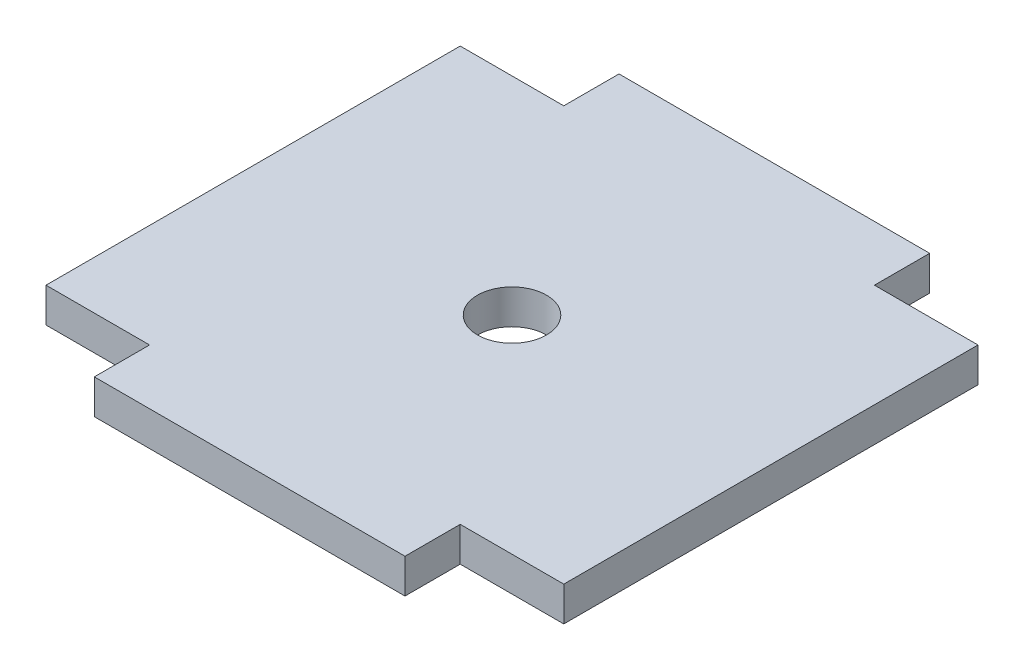
ISO-10303-21;
HEADER;
FILE_DESCRIPTION(('STEP AP214'),'2;1');
FILE_NAME('part.step','',(''),(''),'','','');
FILE_SCHEMA(('AUTOMOTIVE_DESIGN { 1 0 10303 214 1 1 1 1 }'));
ENDSEC;
DATA;
#1=APPLICATION_CONTEXT('core data for automotive mechanical design processes');
#2=APPLICATION_PROTOCOL_DEFINITION('international standard','automotive_design',2000,#1);
#3=PRODUCT_CONTEXT('',#1,'mechanical');
#4=PRODUCT('Part','Part','',(#3));
#5=PRODUCT_RELATED_PRODUCT_CATEGORY('part','',(#4));
#6=PRODUCT_DEFINITION_FORMATION('','',#4);
#7=PRODUCT_DEFINITION_CONTEXT('part definition',#1,'design');
#8=PRODUCT_DEFINITION('design','',#6,#7);
#9=PRODUCT_DEFINITION_SHAPE('','',#8);
#10=(LENGTH_UNIT() NAMED_UNIT(*) SI_UNIT(.MILLI.,.METRE.));
#11=(NAMED_UNIT(*) PLANE_ANGLE_UNIT() SI_UNIT($,.RADIAN.));
#12=(NAMED_UNIT(*) SI_UNIT($,.STERADIAN.) SOLID_ANGLE_UNIT());
#13=UNCERTAINTY_MEASURE_WITH_UNIT(LENGTH_MEASURE(1.E-05),#10,'distance_accuracy_value','');
#14=(GEOMETRIC_REPRESENTATION_CONTEXT(3) GLOBAL_UNCERTAINTY_ASSIGNED_CONTEXT((#13)) GLOBAL_UNIT_ASSIGNED_CONTEXT((#10,
#11,#12)) REPRESENTATION_CONTEXT('',''));
#15=CARTESIAN_POINT('',(0.,0.,0.));
#16=DIRECTION('',(0.,0.,1.));
#17=DIRECTION('',(1.,0.,0.));
#18=AXIS2_PLACEMENT_3D('',#15,#16,#17);
#19=CARTESIAN_POINT('',(-37.5,5.,-30.));
#20=DIRECTION('',(0.,0.,1.));
#21=DIRECTION('',(1.,0.,0.));
#22=AXIS2_PLACEMENT_3D('',#19,#20,#21);
#23=PLANE('',#22);
#24=DIRECTION('',(-1.,0.,0.));
#25=VECTOR('',#24,1.);
#26=CARTESIAN_POINT('',(-37.5,0.,-30.));
#27=LINE('',#26,#25);
#28=CARTESIAN_POINT('',(37.5,0.,-30.));
#29=VERTEX_POINT('',#28);
#30=CARTESIAN_POINT('',(22.5,0.,-30.));
#31=VERTEX_POINT('',#30);
#32=EDGE_CURVE('E222',#29,#31,#27,.T.);
#33=ORIENTED_EDGE('',*,*,#32,.T.);
#34=DIRECTION('',(0.,1.,0.));
#35=VECTOR('',#34,1.);
#36=CARTESIAN_POINT('',(22.5,0.,-30.));
#37=LINE('',#36,#35);
#38=CARTESIAN_POINT('',(22.5,5.,-30.));
#39=VERTEX_POINT('',#38);
#40=EDGE_CURVE('E131',#31,#39,#37,.T.);
#41=ORIENTED_EDGE('',*,*,#40,.T.);
#42=DIRECTION('',(-1.,0.,0.));
#43=VECTOR('',#42,1.);
#44=CARTESIAN_POINT('',(-37.5,5.,-30.));
#45=LINE('',#44,#43);
#46=CARTESIAN_POINT('',(37.5,5.,-30.));
#47=VERTEX_POINT('',#46);
#48=EDGE_CURVE('E174',#47,#39,#45,.T.);
#49=ORIENTED_EDGE('',*,*,#48,.F.);
#50=DIRECTION('',(0.,-1.,0.));
#51=VECTOR('',#50,1.);
#52=CARTESIAN_POINT('',(37.5,5.,-30.));
#53=LINE('',#52,#51);
#54=EDGE_CURVE('E11',#47,#29,#53,.T.);
#55=ORIENTED_EDGE('',*,*,#54,.T.);
#56=EDGE_LOOP('',(#33,#41,#49,#55));
#57=FACE_BOUND('',#56,.T.);
#58=ADVANCED_FACE('F33',(#57),#23,.F.);
#59=CARTESIAN_POINT('',(-37.5,5.,30.));
#60=DIRECTION('',(0.,0.,-1.));
#61=DIRECTION('',(-1.,0.,0.));
#62=AXIS2_PLACEMENT_3D('',#59,#60,#61);
#63=PLANE('',#62);
#64=DIRECTION('',(0.,1.,0.));
#65=VECTOR('',#64,1.);
#66=CARTESIAN_POINT('',(22.5,0.,30.));
#67=LINE('',#66,#65);
#68=CARTESIAN_POINT('',(22.5,0.,30.));
#69=VERTEX_POINT('',#68);
#70=CARTESIAN_POINT('',(22.5,5.,30.));
#71=VERTEX_POINT('',#70);
#72=EDGE_CURVE('E135',#69,#71,#67,.T.);
#73=ORIENTED_EDGE('',*,*,#72,.F.);
#74=DIRECTION('',(1.,0.,0.));
#75=VECTOR('',#74,1.);
#76=CARTESIAN_POINT('',(-37.5,0.,30.));
#77=LINE('',#76,#75);
#78=CARTESIAN_POINT('',(37.5,0.,30.));
#79=VERTEX_POINT('',#78);
#80=EDGE_CURVE('E196',#69,#79,#77,.T.);
#81=ORIENTED_EDGE('',*,*,#80,.T.);
#82=DIRECTION('',(0.,-1.,0.));
#83=VECTOR('',#82,1.);
#84=CARTESIAN_POINT('',(37.5,5.,30.));
#85=LINE('',#84,#83);
#86=CARTESIAN_POINT('',(37.5,5.,30.));
#87=VERTEX_POINT('',#86);
#88=EDGE_CURVE('E195',#87,#79,#85,.T.);
#89=ORIENTED_EDGE('',*,*,#88,.F.);
#90=DIRECTION('',(1.,0.,0.));
#91=VECTOR('',#90,1.);
#92=CARTESIAN_POINT('',(-37.5,5.,30.));
#93=LINE('',#92,#91);
#94=EDGE_CURVE('E58',#71,#87,#93,.T.);
#95=ORIENTED_EDGE('',*,*,#94,.F.);
#96=EDGE_LOOP('',(#73,#81,#89,#95));
#97=FACE_BOUND('',#96,.T.);
#98=ADVANCED_FACE('F295',(#97),#63,.F.);
#99=DIRECTION('',(0.,-1.,0.));
#100=VECTOR('',#99,1.);
#101=CARTESIAN_POINT('',(-22.5,0.,30.));
#102=LINE('',#101,#100);
#103=CARTESIAN_POINT('',(-22.5,5.,30.));
#104=VERTEX_POINT('',#103);
#105=CARTESIAN_POINT('',(-22.5,0.,30.));
#106=VERTEX_POINT('',#105);
#107=EDGE_CURVE('E238',#104,#106,#102,.T.);
#108=ORIENTED_EDGE('',*,*,#107,.F.);
#109=CARTESIAN_POINT('',(-37.5,5.,30.));
#110=VERTEX_POINT('',#109);
#111=EDGE_CURVE('E192',#110,#104,#93,.T.);
#112=ORIENTED_EDGE('',*,*,#111,.F.);
#113=DIRECTION('',(0.,-1.,0.));
#114=VECTOR('',#113,1.);
#115=CARTESIAN_POINT('',(-37.5,5.,30.));
#116=LINE('',#115,#114);
#117=CARTESIAN_POINT('',(-37.5,0.,30.));
#118=VERTEX_POINT('',#117);
#119=EDGE_CURVE('E207',#110,#118,#116,.T.);
#120=ORIENTED_EDGE('',*,*,#119,.T.);
#121=EDGE_CURVE('E199',#118,#106,#77,.T.);
#122=ORIENTED_EDGE('',*,*,#121,.T.);
#123=EDGE_LOOP('',(#108,#112,#120,#122));
#124=FACE_BOUND('',#123,.T.);
#125=ADVANCED_FACE('F278',(#124),#63,.F.);
#126=CARTESIAN_POINT('',(37.5,5.,30.));
#127=DIRECTION('',(-1.,0.,0.));
#128=DIRECTION('',(0.,0.,1.));
#129=AXIS2_PLACEMENT_3D('',#126,#127,#128);
#130=PLANE('',#129);
#131=DIRECTION('',(0.,0.,-1.));
#132=VECTOR('',#131,1.);
#133=CARTESIAN_POINT('',(37.5,0.,30.));
#134=LINE('',#133,#132);
#135=EDGE_CURVE('E186',#79,#29,#134,.T.);
#136=ORIENTED_EDGE('',*,*,#135,.T.);
#137=ORIENTED_EDGE('',*,*,#54,.F.);
#138=DIRECTION('',(0.,0.,-1.));
#139=VECTOR('',#138,1.);
#140=CARTESIAN_POINT('',(37.5,5.,30.));
#141=LINE('',#140,#139);
#142=EDGE_CURVE('E175',#87,#47,#141,.T.);
#143=ORIENTED_EDGE('',*,*,#142,.F.);
#144=ORIENTED_EDGE('',*,*,#88,.T.);
#145=EDGE_LOOP('',(#136,#137,#143,#144));
#146=FACE_BOUND('',#145,.T.);
#147=ADVANCED_FACE('F35',(#146),#130,.F.);
#148=CARTESIAN_POINT('',(-22.5,5.,-30.));
#149=VERTEX_POINT('',#148);
#150=CARTESIAN_POINT('',(-37.5,5.,-30.));
#151=VERTEX_POINT('',#150);
#152=EDGE_CURVE('E171',#149,#151,#45,.T.);
#153=ORIENTED_EDGE('',*,*,#152,.F.);
#154=DIRECTION('',(0.,-1.,0.));
#155=VECTOR('',#154,1.);
#156=CARTESIAN_POINT('',(-22.5,0.,-30.));
#157=LINE('',#156,#155);
#158=CARTESIAN_POINT('',(-22.5,0.,-30.));
#159=VERTEX_POINT('',#158);
#160=EDGE_CURVE('E143',#149,#159,#157,.T.);
#161=ORIENTED_EDGE('',*,*,#160,.T.);
#162=CARTESIAN_POINT('',(-37.5,0.,-30.));
#163=VERTEX_POINT('',#162);
#164=EDGE_CURVE('E220',#159,#163,#27,.T.);
#165=ORIENTED_EDGE('',*,*,#164,.T.);
#166=DIRECTION('',(0.,-1.,0.));
#167=VECTOR('',#166,1.);
#168=CARTESIAN_POINT('',(-37.5,5.,-30.));
#169=LINE('',#168,#167);
#170=EDGE_CURVE('E42',#151,#163,#169,.T.);
#171=ORIENTED_EDGE('',*,*,#170,.F.);
#172=EDGE_LOOP('',(#153,#161,#165,#171));
#173=FACE_BOUND('',#172,.T.);
#174=ADVANCED_FACE('F302',(#173),#23,.F.);
#175=CARTESIAN_POINT('',(-37.5,5.,30.));
#176=DIRECTION('',(1.,0.,0.));
#177=DIRECTION('',(0.,0.,-1.));
#178=AXIS2_PLACEMENT_3D('',#175,#176,#177);
#179=PLANE('',#178);
#180=DIRECTION('',(0.,0.,1.));
#181=VECTOR('',#180,1.);
#182=CARTESIAN_POINT('',(-37.5,0.,30.));
#183=LINE('',#182,#181);
#184=EDGE_CURVE('E200',#163,#118,#183,.T.);
#185=ORIENTED_EDGE('',*,*,#184,.T.);
#186=ORIENTED_EDGE('',*,*,#119,.F.);
#187=DIRECTION('',(0.,0.,1.));
#188=VECTOR('',#187,1.);
#189=CARTESIAN_POINT('',(-37.5,5.,30.));
#190=LINE('',#189,#188);
#191=EDGE_CURVE('E181',#151,#110,#190,.T.);
#192=ORIENTED_EDGE('',*,*,#191,.F.);
#193=ORIENTED_EDGE('',*,*,#170,.T.);
#194=EDGE_LOOP('',(#185,#186,#192,#193));
#195=FACE_BOUND('',#194,.T.);
#196=ADVANCED_FACE('F215',(#195),#179,.F.);
#197=CARTESIAN_POINT('',(37.5,5.,-30.));
#198=DIRECTION('',(0.,-1.,0.));
#199=DIRECTION('',(0.,0.,-1.));
#200=AXIS2_PLACEMENT_3D('',#197,#198,#199);
#201=PLANE('',#200);
#202=CARTESIAN_POINT('',(0.,5.,0.));
#203=DIRECTION('',(0.,1.,0.));
#204=DIRECTION('',(0.,0.,1.));
#205=AXIS2_PLACEMENT_3D('',#202,#203,#204);
#206=CIRCLE('',#205,5.);
#207=CARTESIAN_POINT('',(0.,5.,5.));
#208=VERTEX_POINT('',#207);
#209=EDGE_CURVE('E259',#208,#208,#206,.T.);
#210=ORIENTED_EDGE('',*,*,#209,.F.);
#211=EDGE_LOOP('',(#210));
#212=FACE_BOUND('',#211,.T.);
#213=ORIENTED_EDGE('',*,*,#142,.T.);
#214=ORIENTED_EDGE('',*,*,#48,.T.);
#215=DIRECTION('',(0.,0.,1.));
#216=VECTOR('',#215,1.);
#217=CARTESIAN_POINT('',(22.5,5.,-38.));
#218=LINE('',#217,#216);
#219=CARTESIAN_POINT('',(22.5,5.,-38.));
#220=VERTEX_POINT('',#219);
#221=EDGE_CURVE('E153',#220,#39,#218,.T.);
#222=ORIENTED_EDGE('',*,*,#221,.F.);
#223=DIRECTION('',(-1.,0.,0.));
#224=VECTOR('',#223,1.);
#225=CARTESIAN_POINT('',(-22.5,5.,-38.));
#226=LINE('',#225,#224);
#227=CARTESIAN_POINT('',(-22.5,5.,-38.));
#228=VERTEX_POINT('',#227);
#229=EDGE_CURVE('E142',#220,#228,#226,.T.);
#230=ORIENTED_EDGE('',*,*,#229,.T.);
#231=DIRECTION('',(0.,0.,1.));
#232=VECTOR('',#231,1.);
#233=CARTESIAN_POINT('',(-22.5,5.,-38.));
#234=LINE('',#233,#232);
#235=EDGE_CURVE('E163',#228,#149,#234,.T.);
#236=ORIENTED_EDGE('',*,*,#235,.T.);
#237=ORIENTED_EDGE('',*,*,#152,.T.);
#238=ORIENTED_EDGE('',*,*,#191,.T.);
#239=ORIENTED_EDGE('',*,*,#111,.T.);
#240=DIRECTION('',(0.,0.,-1.));
#241=VECTOR('',#240,1.);
#242=CARTESIAN_POINT('',(-22.5,5.,38.));
#243=LINE('',#242,#241);
#244=CARTESIAN_POINT('',(-22.5,5.,38.));
#245=VERTEX_POINT('',#244);
#246=EDGE_CURVE('E252',#245,#104,#243,.T.);
#247=ORIENTED_EDGE('',*,*,#246,.F.);
#248=DIRECTION('',(-1.,0.,0.));
#249=VECTOR('',#248,1.);
#250=CARTESIAN_POINT('',(-22.5,5.,38.));
#251=LINE('',#250,#249);
#252=CARTESIAN_POINT('',(22.5,5.,38.));
#253=VERTEX_POINT('',#252);
#254=EDGE_CURVE('E290',#253,#245,#251,.T.);
#255=ORIENTED_EDGE('',*,*,#254,.F.);
#256=DIRECTION('',(0.,0.,-1.));
#257=VECTOR('',#256,1.);
#258=CARTESIAN_POINT('',(22.5,5.,38.));
#259=LINE('',#258,#257);
#260=EDGE_CURVE('E257',#253,#71,#259,.T.);
#261=ORIENTED_EDGE('',*,*,#260,.T.);
#262=ORIENTED_EDGE('',*,*,#94,.T.);
#263=EDGE_LOOP('',(#213,#214,#222,#230,#236,#237,#238,#239,#247,#255,#261,#262));
#264=FACE_BOUND('',#263,.T.);
#265=ADVANCED_FACE('F276',(#212,#264),#201,.F.);
#266=CARTESIAN_POINT('',(37.5,0.,-30.));
#267=DIRECTION('',(0.,-1.,0.));
#268=DIRECTION('',(0.,0.,-1.));
#269=AXIS2_PLACEMENT_3D('',#266,#267,#268);
#270=PLANE('',#269);
#271=CARTESIAN_POINT('',(0.,0.,0.));
#272=DIRECTION('',(0.,1.,0.));
#273=DIRECTION('',(0.,0.,1.));
#274=AXIS2_PLACEMENT_3D('',#271,#272,#273);
#275=CIRCLE('',#274,5.);
#276=CARTESIAN_POINT('',(0.,0.,5.));
#277=VERTEX_POINT('',#276);
#278=EDGE_CURVE('E247',#277,#277,#275,.T.);
#279=ORIENTED_EDGE('',*,*,#278,.T.);
#280=EDGE_LOOP('',(#279));
#281=FACE_BOUND('',#280,.T.);
#282=ORIENTED_EDGE('',*,*,#135,.F.);
#283=ORIENTED_EDGE('',*,*,#80,.F.);
#284=DIRECTION('',(0.,0.,-1.));
#285=VECTOR('',#284,1.);
#286=CARTESIAN_POINT('',(22.5,0.,38.));
#287=LINE('',#286,#285);
#288=CARTESIAN_POINT('',(22.5,0.,38.));
#289=VERTEX_POINT('',#288);
#290=EDGE_CURVE('E230',#289,#69,#287,.T.);
#291=ORIENTED_EDGE('',*,*,#290,.F.);
#292=DIRECTION('',(1.,0.,0.));
#293=VECTOR('',#292,1.);
#294=CARTESIAN_POINT('',(-22.5,0.,38.));
#295=LINE('',#294,#293);
#296=CARTESIAN_POINT('',(-22.5,0.,38.));
#297=VERTEX_POINT('',#296);
#298=EDGE_CURVE('E234',#297,#289,#295,.T.);
#299=ORIENTED_EDGE('',*,*,#298,.F.);
#300=DIRECTION('',(0.,0.,-1.));
#301=VECTOR('',#300,1.);
#302=CARTESIAN_POINT('',(-22.5,0.,38.));
#303=LINE('',#302,#301);
#304=EDGE_CURVE('E233',#297,#106,#303,.T.);
#305=ORIENTED_EDGE('',*,*,#304,.T.);
#306=ORIENTED_EDGE('',*,*,#121,.F.);
#307=ORIENTED_EDGE('',*,*,#184,.F.);
#308=ORIENTED_EDGE('',*,*,#164,.F.);
#309=DIRECTION('',(0.,0.,1.));
#310=VECTOR('',#309,1.);
#311=CARTESIAN_POINT('',(-22.5,0.,-38.));
#312=LINE('',#311,#310);
#313=CARTESIAN_POINT('',(-22.5,0.,-38.));
#314=VERTEX_POINT('',#313);
#315=EDGE_CURVE('E50',#314,#159,#312,.T.);
#316=ORIENTED_EDGE('',*,*,#315,.F.);
#317=DIRECTION('',(1.,0.,0.));
#318=VECTOR('',#317,1.);
#319=CARTESIAN_POINT('',(-22.5,0.,-38.));
#320=LINE('',#319,#318);
#321=CARTESIAN_POINT('',(22.5,0.,-38.));
#322=VERTEX_POINT('',#321);
#323=EDGE_CURVE('E140',#314,#322,#320,.T.);
#324=ORIENTED_EDGE('',*,*,#323,.T.);
#325=DIRECTION('',(0.,0.,1.));
#326=VECTOR('',#325,1.);
#327=CARTESIAN_POINT('',(22.5,0.,-38.));
#328=LINE('',#327,#326);
#329=EDGE_CURVE('E125',#322,#31,#328,.T.);
#330=ORIENTED_EDGE('',*,*,#329,.T.);
#331=ORIENTED_EDGE('',*,*,#32,.F.);
#332=EDGE_LOOP('',(#282,#283,#291,#299,#305,#306,#307,#308,#316,#324,#330,#331));
#333=FACE_BOUND('',#332,.T.);
#334=ADVANCED_FACE('F146',(#281,#333),#270,.T.);
#335=CARTESIAN_POINT('',(0.,0.,0.));
#336=DIRECTION('',(0.,1.,0.));
#337=DIRECTION('',(0.,0.,1.));
#338=AXIS2_PLACEMENT_3D('',#335,#336,#337);
#339=CYLINDRICAL_SURFACE('',#338,5.);
#340=ORIENTED_EDGE('',*,*,#278,.F.);
#341=EDGE_LOOP('',(#340));
#342=FACE_BOUND('',#341,.T.);
#343=ORIENTED_EDGE('',*,*,#209,.T.);
#344=EDGE_LOOP('',(#343));
#345=FACE_BOUND('',#344,.T.);
#346=ADVANCED_FACE('F327',(#342,#345),#339,.F.);
#347=CARTESIAN_POINT('',(22.5,0.,38.));
#348=DIRECTION('',(-1.,0.,0.));
#349=DIRECTION('',(0.,0.,1.));
#350=AXIS2_PLACEMENT_3D('',#347,#348,#349);
#351=PLANE('',#350);
#352=ORIENTED_EDGE('',*,*,#72,.T.);
#353=ORIENTED_EDGE('',*,*,#260,.F.);
#354=DIRECTION('',(0.,1.,0.));
#355=VECTOR('',#354,1.);
#356=CARTESIAN_POINT('',(22.5,0.,38.));
#357=LINE('',#356,#355);
#358=EDGE_CURVE('E250',#289,#253,#357,.T.);
#359=ORIENTED_EDGE('',*,*,#358,.F.);
#360=ORIENTED_EDGE('',*,*,#290,.T.);
#361=EDGE_LOOP('',(#352,#353,#359,#360));
#362=FACE_BOUND('',#361,.T.);
#363=ADVANCED_FACE('F294',(#362),#351,.F.);
#364=CARTESIAN_POINT('',(-22.5,0.,38.));
#365=DIRECTION('',(1.,0.,0.));
#366=DIRECTION('',(0.,0.,-1.));
#367=AXIS2_PLACEMENT_3D('',#364,#365,#366);
#368=PLANE('',#367);
#369=ORIENTED_EDGE('',*,*,#107,.T.);
#370=ORIENTED_EDGE('',*,*,#304,.F.);
#371=DIRECTION('',(0.,-1.,0.));
#372=VECTOR('',#371,1.);
#373=CARTESIAN_POINT('',(-22.5,0.,38.));
#374=LINE('',#373,#372);
#375=EDGE_CURVE('E289',#245,#297,#374,.T.);
#376=ORIENTED_EDGE('',*,*,#375,.F.);
#377=ORIENTED_EDGE('',*,*,#246,.T.);
#378=EDGE_LOOP('',(#369,#370,#376,#377));
#379=FACE_BOUND('',#378,.T.);
#380=ADVANCED_FACE('F282',(#379),#368,.F.);
#381=CARTESIAN_POINT('',(22.5,5.,38.));
#382=DIRECTION('',(0.,0.,-1.));
#383=DIRECTION('',(-1.,0.,0.));
#384=AXIS2_PLACEMENT_3D('',#381,#382,#383);
#385=PLANE('',#384);
#386=ORIENTED_EDGE('',*,*,#358,.T.);
#387=ORIENTED_EDGE('',*,*,#254,.T.);
#388=ORIENTED_EDGE('',*,*,#375,.T.);
#389=ORIENTED_EDGE('',*,*,#298,.T.);
#390=EDGE_LOOP('',(#386,#387,#388,#389));
#391=FACE_BOUND('',#390,.T.);
#392=ADVANCED_FACE('F292',(#391),#385,.F.);
#393=CARTESIAN_POINT('',(22.5,0.,-38.));
#394=DIRECTION('',(1.,0.,0.));
#395=DIRECTION('',(0.,0.,-1.));
#396=AXIS2_PLACEMENT_3D('',#393,#394,#395);
#397=PLANE('',#396);
#398=ORIENTED_EDGE('',*,*,#40,.F.);
#399=ORIENTED_EDGE('',*,*,#329,.F.);
#400=DIRECTION('',(0.,1.,0.));
#401=VECTOR('',#400,1.);
#402=CARTESIAN_POINT('',(22.5,0.,-38.));
#403=LINE('',#402,#401);
#404=EDGE_CURVE('E128',#322,#220,#403,.T.);
#405=ORIENTED_EDGE('',*,*,#404,.T.);
#406=ORIENTED_EDGE('',*,*,#221,.T.);
#407=EDGE_LOOP('',(#398,#399,#405,#406));
#408=FACE_BOUND('',#407,.T.);
#409=ADVANCED_FACE('F127',(#408),#397,.T.);
#410=CARTESIAN_POINT('',(-22.5,0.,-38.));
#411=DIRECTION('',(-1.,0.,0.));
#412=DIRECTION('',(0.,0.,1.));
#413=AXIS2_PLACEMENT_3D('',#410,#411,#412);
#414=PLANE('',#413);
#415=ORIENTED_EDGE('',*,*,#160,.F.);
#416=ORIENTED_EDGE('',*,*,#235,.F.);
#417=DIRECTION('',(0.,-1.,0.));
#418=VECTOR('',#417,1.);
#419=CARTESIAN_POINT('',(-22.5,0.,-38.));
#420=LINE('',#419,#418);
#421=EDGE_CURVE('E148',#228,#314,#420,.T.);
#422=ORIENTED_EDGE('',*,*,#421,.T.);
#423=ORIENTED_EDGE('',*,*,#315,.T.);
#424=EDGE_LOOP('',(#415,#416,#422,#423));
#425=FACE_BOUND('',#424,.T.);
#426=ADVANCED_FACE('F311',(#425),#414,.T.);
#427=CARTESIAN_POINT('',(22.5,5.,-38.));
#428=DIRECTION('',(0.,0.,1.));
#429=DIRECTION('',(-1.,0.,0.));
#430=AXIS2_PLACEMENT_3D('',#427,#428,#429);
#431=PLANE('',#430);
#432=ORIENTED_EDGE('',*,*,#404,.F.);
#433=ORIENTED_EDGE('',*,*,#323,.F.);
#434=ORIENTED_EDGE('',*,*,#421,.F.);
#435=ORIENTED_EDGE('',*,*,#229,.F.);
#436=EDGE_LOOP('',(#432,#433,#434,#435));
#437=FACE_BOUND('',#436,.T.);
#438=ADVANCED_FACE('F138',(#437),#431,.F.);
#439=CLOSED_SHELL('',(#58,#98,#125,#147,#174,#196,#265,#334,#346,#363,#380,#392,#409,#426,#438));
#440=MANIFOLD_SOLID_BREP('B2',#439);
#441=ADVANCED_BREP_SHAPE_REPRESENTATION('',(#18,#440),#14);
#442=SHAPE_DEFINITION_REPRESENTATION(#9,#441);
ENDSEC;
END-ISO-10303-21;
